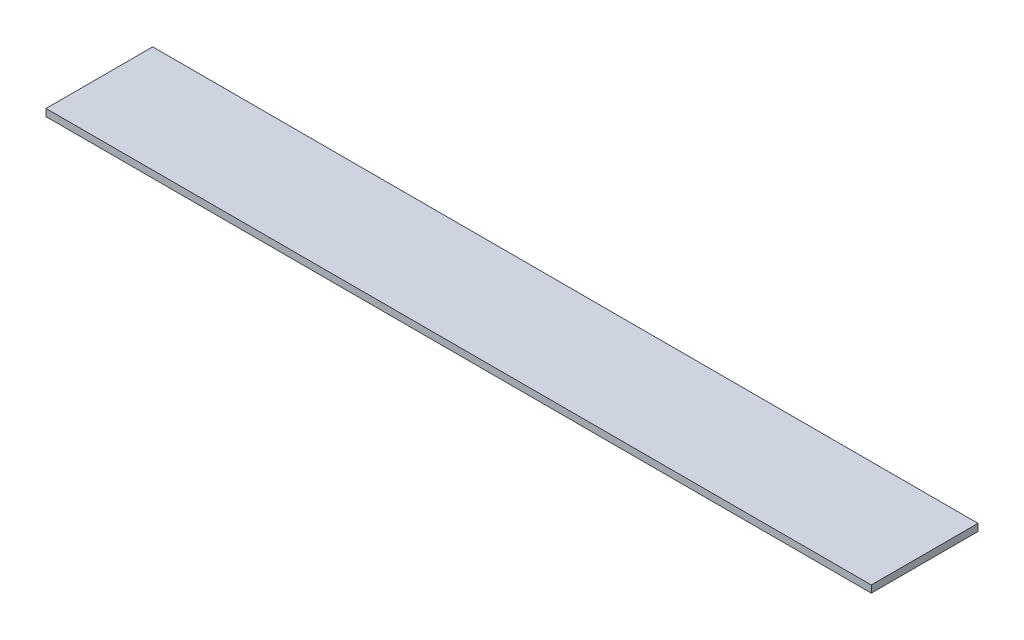
ISO-10303-21;
HEADER;
FILE_DESCRIPTION(('STEP AP214'),'2;1');
FILE_NAME('part.step','',(''),(''),'','','');
FILE_SCHEMA(('AUTOMOTIVE_DESIGN { 1 0 10303 214 1 1 1 1 }'));
ENDSEC;
DATA;
#1=APPLICATION_CONTEXT('core data for automotive mechanical design processes');
#2=APPLICATION_PROTOCOL_DEFINITION('international standard','automotive_design',2000,#1);
#3=PRODUCT_CONTEXT('',#1,'mechanical');
#4=PRODUCT('Part','Part','',(#3));
#5=PRODUCT_RELATED_PRODUCT_CATEGORY('part','',(#4));
#6=PRODUCT_DEFINITION_FORMATION('','',#4);
#7=PRODUCT_DEFINITION_CONTEXT('part definition',#1,'design');
#8=PRODUCT_DEFINITION('design','',#6,#7);
#9=PRODUCT_DEFINITION_SHAPE('','',#8);
#10=(LENGTH_UNIT() NAMED_UNIT(*) SI_UNIT(.MILLI.,.METRE.));
#11=(NAMED_UNIT(*) PLANE_ANGLE_UNIT() SI_UNIT($,.RADIAN.));
#12=(NAMED_UNIT(*) SI_UNIT($,.STERADIAN.) SOLID_ANGLE_UNIT());
#13=UNCERTAINTY_MEASURE_WITH_UNIT(LENGTH_MEASURE(1.E-05),#10,'distance_accuracy_value','');
#14=(GEOMETRIC_REPRESENTATION_CONTEXT(3) GLOBAL_UNCERTAINTY_ASSIGNED_CONTEXT((#13)) GLOBAL_UNIT_ASSIGNED_CONTEXT((#10,
#11,#12)) REPRESENTATION_CONTEXT('',''));
#15=CARTESIAN_POINT('',(0.,0.,0.));
#16=DIRECTION('',(0.,0.,1.));
#17=DIRECTION('',(1.,0.,0.));
#18=AXIS2_PLACEMENT_3D('',#15,#16,#17);
#19=CARTESIAN_POINT('',(-290.,5.,-37.5));
#20=DIRECTION('',(1.,0.,0.));
#21=DIRECTION('',(0.,0.,-1.));
#22=AXIS2_PLACEMENT_3D('',#19,#20,#21);
#23=PLANE('',#22);
#24=DIRECTION('',(0.,0.,1.));
#25=VECTOR('',#24,1.);
#26=CARTESIAN_POINT('',(-290.,0.,-37.5));
#27=LINE('',#26,#25);
#28=CARTESIAN_POINT('',(-290.,0.,-37.5));
#29=VERTEX_POINT('',#28);
#30=CARTESIAN_POINT('',(-290.,0.,37.5));
#31=VERTEX_POINT('',#30);
#32=EDGE_CURVE('E100',#29,#31,#27,.T.);
#33=ORIENTED_EDGE('',*,*,#32,.T.);
#34=DIRECTION('',(0.,-1.,0.));
#35=VECTOR('',#34,1.);
#36=CARTESIAN_POINT('',(-290.,5.,37.5));
#37=LINE('',#36,#35);
#38=CARTESIAN_POINT('',(-290.,5.,37.5));
#39=VERTEX_POINT('',#38);
#40=EDGE_CURVE('E11',#39,#31,#37,.T.);
#41=ORIENTED_EDGE('',*,*,#40,.F.);
#42=DIRECTION('',(0.,0.,1.));
#43=VECTOR('',#42,1.);
#44=CARTESIAN_POINT('',(-290.,5.,-37.5));
#45=LINE('',#44,#43);
#46=CARTESIAN_POINT('',(-290.,5.,-37.5));
#47=VERTEX_POINT('',#46);
#48=EDGE_CURVE('E88',#47,#39,#45,.T.);
#49=ORIENTED_EDGE('',*,*,#48,.F.);
#50=DIRECTION('',(0.,-1.,0.));
#51=VECTOR('',#50,1.);
#52=CARTESIAN_POINT('',(-290.,5.,-37.5));
#53=LINE('',#52,#51);
#54=EDGE_CURVE('E96',#47,#29,#53,.T.);
#55=ORIENTED_EDGE('',*,*,#54,.T.);
#56=EDGE_LOOP('',(#33,#41,#49,#55));
#57=FACE_BOUND('',#56,.T.);
#58=ADVANCED_FACE('F37',(#57),#23,.F.);
#59=CARTESIAN_POINT('',(-290.,5.,37.5));
#60=DIRECTION('',(0.,0.,-1.));
#61=DIRECTION('',(-1.,0.,0.));
#62=AXIS2_PLACEMENT_3D('',#59,#60,#61);
#63=PLANE('',#62);
#64=DIRECTION('',(1.,0.,0.));
#65=VECTOR('',#64,1.);
#66=CARTESIAN_POINT('',(-290.,0.,37.5));
#67=LINE('',#66,#65);
#68=CARTESIAN_POINT('',(290.,0.,37.5));
#69=VERTEX_POINT('',#68);
#70=EDGE_CURVE('E92',#31,#69,#67,.T.);
#71=ORIENTED_EDGE('',*,*,#70,.T.);
#72=DIRECTION('',(0.,-1.,0.));
#73=VECTOR('',#72,1.);
#74=CARTESIAN_POINT('',(290.,5.,37.5));
#75=LINE('',#74,#73);
#76=CARTESIAN_POINT('',(290.,5.,37.5));
#77=VERTEX_POINT('',#76);
#78=EDGE_CURVE('E45',#77,#69,#75,.T.);
#79=ORIENTED_EDGE('',*,*,#78,.F.);
#80=DIRECTION('',(1.,0.,0.));
#81=VECTOR('',#80,1.);
#82=CARTESIAN_POINT('',(-290.,5.,37.5));
#83=LINE('',#82,#81);
#84=EDGE_CURVE('E83',#39,#77,#83,.T.);
#85=ORIENTED_EDGE('',*,*,#84,.F.);
#86=ORIENTED_EDGE('',*,*,#40,.T.);
#87=EDGE_LOOP('',(#71,#79,#85,#86));
#88=FACE_BOUND('',#87,.T.);
#89=ADVANCED_FACE('F91',(#88),#63,.F.);
#90=CARTESIAN_POINT('',(290.,5.,-37.5));
#91=DIRECTION('',(-1.,0.,0.));
#92=DIRECTION('',(0.,0.,1.));
#93=AXIS2_PLACEMENT_3D('',#90,#91,#92);
#94=PLANE('',#93);
#95=DIRECTION('',(0.,0.,-1.));
#96=VECTOR('',#95,1.);
#97=CARTESIAN_POINT('',(290.,0.,-37.5));
#98=LINE('',#97,#96);
#99=CARTESIAN_POINT('',(290.,0.,-37.5));
#100=VERTEX_POINT('',#99);
#101=EDGE_CURVE('E70',#69,#100,#98,.T.);
#102=ORIENTED_EDGE('',*,*,#101,.T.);
#103=DIRECTION('',(0.,-1.,0.));
#104=VECTOR('',#103,1.);
#105=CARTESIAN_POINT('',(290.,5.,-37.5));
#106=LINE('',#105,#104);
#107=CARTESIAN_POINT('',(290.,5.,-37.5));
#108=VERTEX_POINT('',#107);
#109=EDGE_CURVE('E93',#108,#100,#106,.T.);
#110=ORIENTED_EDGE('',*,*,#109,.F.);
#111=DIRECTION('',(0.,0.,-1.));
#112=VECTOR('',#111,1.);
#113=CARTESIAN_POINT('',(290.,5.,-37.5));
#114=LINE('',#113,#112);
#115=EDGE_CURVE('E86',#77,#108,#114,.T.);
#116=ORIENTED_EDGE('',*,*,#115,.F.);
#117=ORIENTED_EDGE('',*,*,#78,.T.);
#118=EDGE_LOOP('',(#102,#110,#116,#117));
#119=FACE_BOUND('',#118,.T.);
#120=ADVANCED_FACE('F94',(#119),#94,.F.);
#121=CARTESIAN_POINT('',(-290.,5.,-37.5));
#122=DIRECTION('',(0.,0.,1.));
#123=DIRECTION('',(1.,0.,0.));
#124=AXIS2_PLACEMENT_3D('',#121,#122,#123);
#125=PLANE('',#124);
#126=DIRECTION('',(-1.,0.,0.));
#127=VECTOR('',#126,1.);
#128=CARTESIAN_POINT('',(-290.,0.,-37.5));
#129=LINE('',#128,#127);
#130=EDGE_CURVE('E76',#100,#29,#129,.T.);
#131=ORIENTED_EDGE('',*,*,#130,.T.);
#132=ORIENTED_EDGE('',*,*,#54,.F.);
#133=DIRECTION('',(-1.,0.,0.));
#134=VECTOR('',#133,1.);
#135=CARTESIAN_POINT('',(-290.,5.,-37.5));
#136=LINE('',#135,#134);
#137=EDGE_CURVE('E53',#108,#47,#136,.T.);
#138=ORIENTED_EDGE('',*,*,#137,.F.);
#139=ORIENTED_EDGE('',*,*,#109,.T.);
#140=EDGE_LOOP('',(#131,#132,#138,#139));
#141=FACE_BOUND('',#140,.T.);
#142=ADVANCED_FACE('F107',(#141),#125,.F.);
#143=CARTESIAN_POINT('',(0.,5.,0.));
#144=DIRECTION('',(0.,1.,0.));
#145=DIRECTION('',(0.,0.,1.));
#146=AXIS2_PLACEMENT_3D('',#143,#144,#145);
#147=PLANE('',#146);
#148=ORIENTED_EDGE('',*,*,#48,.T.);
#149=ORIENTED_EDGE('',*,*,#84,.T.);
#150=ORIENTED_EDGE('',*,*,#115,.T.);
#151=ORIENTED_EDGE('',*,*,#137,.T.);
#152=EDGE_LOOP('',(#148,#149,#150,#151));
#153=FACE_BOUND('',#152,.T.);
#154=ADVANCED_FACE('F84',(#153),#147,.T.);
#155=CARTESIAN_POINT('',(0.,0.,0.));
#156=DIRECTION('',(0.,1.,0.));
#157=DIRECTION('',(0.,0.,1.));
#158=AXIS2_PLACEMENT_3D('',#155,#156,#157);
#159=PLANE('',#158);
#160=ORIENTED_EDGE('',*,*,#32,.F.);
#161=ORIENTED_EDGE('',*,*,#130,.F.);
#162=ORIENTED_EDGE('',*,*,#101,.F.);
#163=ORIENTED_EDGE('',*,*,#70,.F.);
#164=EDGE_LOOP('',(#160,#161,#162,#163));
#165=FACE_BOUND('',#164,.T.);
#166=ADVANCED_FACE('F110',(#165),#159,.F.);
#167=CLOSED_SHELL('',(#58,#89,#120,#142,#154,#166));
#168=MANIFOLD_SOLID_BREP('B2',#167);
#169=ADVANCED_BREP_SHAPE_REPRESENTATION('',(#18,#168),#14);
#170=SHAPE_DEFINITION_REPRESENTATION(#9,#169);
ENDSEC;
END-ISO-10303-21;
